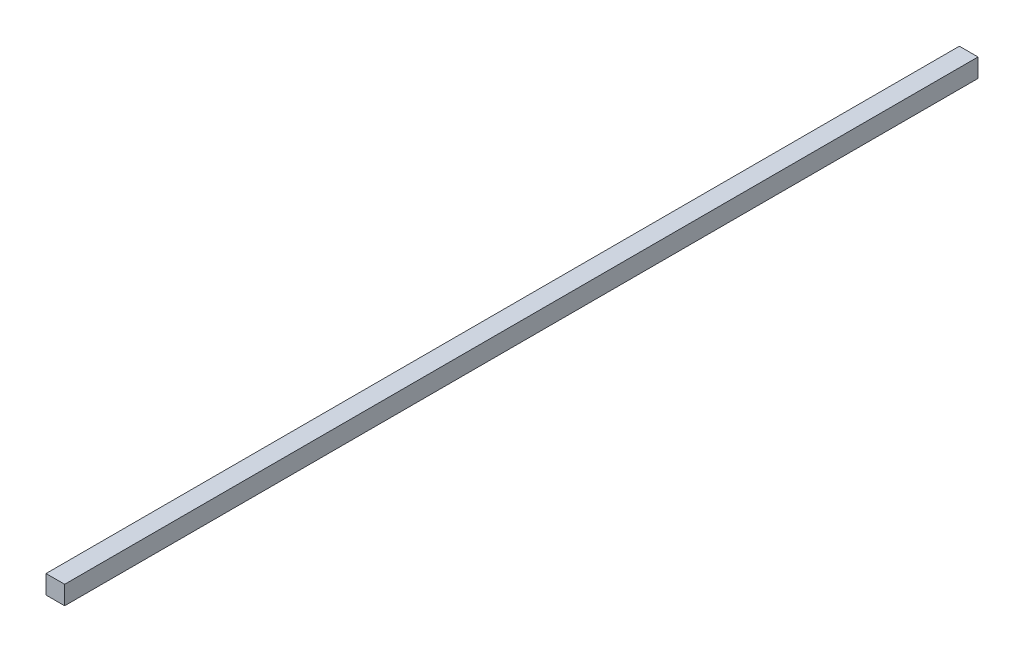
ISO-10303-21;
HEADER;
FILE_DESCRIPTION(('STEP AP214'),'2;1');
FILE_NAME('part.step','',(''),(''),'','','');
FILE_SCHEMA(('AUTOMOTIVE_DESIGN { 1 0 10303 214 1 1 1 1 }'));
ENDSEC;
DATA;
#1=APPLICATION_CONTEXT('core data for automotive mechanical design processes');
#2=APPLICATION_PROTOCOL_DEFINITION('international standard','automotive_design',2000,#1);
#3=PRODUCT_CONTEXT('',#1,'mechanical');
#4=PRODUCT('Part','Part','',(#3));
#5=PRODUCT_RELATED_PRODUCT_CATEGORY('part','',(#4));
#6=PRODUCT_DEFINITION_FORMATION('','',#4);
#7=PRODUCT_DEFINITION_CONTEXT('part definition',#1,'design');
#8=PRODUCT_DEFINITION('design','',#6,#7);
#9=PRODUCT_DEFINITION_SHAPE('','',#8);
#10=(LENGTH_UNIT() NAMED_UNIT(*) SI_UNIT(.MILLI.,.METRE.));
#11=(NAMED_UNIT(*) PLANE_ANGLE_UNIT() SI_UNIT($,.RADIAN.));
#12=(NAMED_UNIT(*) SI_UNIT($,.STERADIAN.) SOLID_ANGLE_UNIT());
#13=UNCERTAINTY_MEASURE_WITH_UNIT(LENGTH_MEASURE(1.E-05),#10,'distance_accuracy_value','');
#14=(GEOMETRIC_REPRESENTATION_CONTEXT(3) GLOBAL_UNCERTAINTY_ASSIGNED_CONTEXT((#13)) GLOBAL_UNIT_ASSIGNED_CONTEXT((#10,
#11,#12)) REPRESENTATION_CONTEXT('',''));
#15=CARTESIAN_POINT('',(0.,0.,0.));
#16=DIRECTION('',(0.,0.,1.));
#17=DIRECTION('',(1.,0.,0.));
#18=AXIS2_PLACEMENT_3D('',#15,#16,#17);
#19=CARTESIAN_POINT('',(-7.41935483870968,6.53225806451613,490.));
#20=DIRECTION('',(1.,0.,0.));
#21=DIRECTION('',(0.,0.,-1.));
#22=AXIS2_PLACEMENT_3D('',#19,#20,#21);
#23=PLANE('',#22);
#24=DIRECTION('',(0.,-1.,0.));
#25=VECTOR('',#24,1.);
#26=CARTESIAN_POINT('',(-7.41935483870968,6.53225806451613,0.));
#27=LINE('',#26,#25);
#28=CARTESIAN_POINT('',(-7.41935483870968,6.53225806451613,0.));
#29=VERTEX_POINT('',#28);
#30=CARTESIAN_POINT('',(-7.41935483870968,-3.46774193548387,0.));
#31=VERTEX_POINT('',#30);
#32=EDGE_CURVE('E96',#29,#31,#27,.T.);
#33=ORIENTED_EDGE('',*,*,#32,.T.);
#34=DIRECTION('',(0.,0.,-1.));
#35=VECTOR('',#34,1.);
#36=CARTESIAN_POINT('',(-7.41935483870968,-3.46774193548387,490.));
#37=LINE('',#36,#35);
#38=CARTESIAN_POINT('',(-7.41935483870968,-3.46774193548387,490.));
#39=VERTEX_POINT('',#38);
#40=EDGE_CURVE('E11',#39,#31,#37,.T.);
#41=ORIENTED_EDGE('',*,*,#40,.F.);
#42=DIRECTION('',(0.,-1.,0.));
#43=VECTOR('',#42,1.);
#44=CARTESIAN_POINT('',(-7.41935483870968,6.53225806451613,490.));
#45=LINE('',#44,#43);
#46=CARTESIAN_POINT('',(-7.41935483870968,6.53225806451613,490.));
#47=VERTEX_POINT('',#46);
#48=EDGE_CURVE('E84',#47,#39,#45,.T.);
#49=ORIENTED_EDGE('',*,*,#48,.F.);
#50=DIRECTION('',(0.,0.,-1.));
#51=VECTOR('',#50,1.);
#52=CARTESIAN_POINT('',(-7.41935483870968,6.53225806451613,490.));
#53=LINE('',#52,#51);
#54=EDGE_CURVE('E92',#47,#29,#53,.T.);
#55=ORIENTED_EDGE('',*,*,#54,.T.);
#56=EDGE_LOOP('',(#33,#41,#49,#55));
#57=FACE_BOUND('',#56,.T.);
#58=ADVANCED_FACE('F33',(#57),#23,.F.);
#59=CARTESIAN_POINT('',(-7.41935483870968,-3.46774193548387,490.));
#60=DIRECTION('',(0.,1.,0.));
#61=DIRECTION('',(0.,0.,1.));
#62=AXIS2_PLACEMENT_3D('',#59,#60,#61);
#63=PLANE('',#62);
#64=DIRECTION('',(1.,0.,0.));
#65=VECTOR('',#64,1.);
#66=CARTESIAN_POINT('',(-7.41935483870968,-3.46774193548387,0.));
#67=LINE('',#66,#65);
#68=CARTESIAN_POINT('',(2.58064516129032,-3.46774193548387,0.));
#69=VERTEX_POINT('',#68);
#70=EDGE_CURVE('E88',#31,#69,#67,.T.);
#71=ORIENTED_EDGE('',*,*,#70,.T.);
#72=DIRECTION('',(0.,0.,-1.));
#73=VECTOR('',#72,1.);
#74=CARTESIAN_POINT('',(2.58064516129032,-3.46774193548387,490.));
#75=LINE('',#74,#73);
#76=CARTESIAN_POINT('',(2.58064516129032,-3.46774193548387,490.));
#77=VERTEX_POINT('',#76);
#78=EDGE_CURVE('E41',#77,#69,#75,.T.);
#79=ORIENTED_EDGE('',*,*,#78,.F.);
#80=DIRECTION('',(1.,0.,0.));
#81=VECTOR('',#80,1.);
#82=CARTESIAN_POINT('',(-7.41935483870968,-3.46774193548387,490.));
#83=LINE('',#82,#81);
#84=EDGE_CURVE('E79',#39,#77,#83,.T.);
#85=ORIENTED_EDGE('',*,*,#84,.F.);
#86=ORIENTED_EDGE('',*,*,#40,.T.);
#87=EDGE_LOOP('',(#71,#79,#85,#86));
#88=FACE_BOUND('',#87,.T.);
#89=ADVANCED_FACE('F87',(#88),#63,.F.);
#90=CARTESIAN_POINT('',(2.58064516129032,6.53225806451613,490.));
#91=DIRECTION('',(-1.,0.,0.));
#92=DIRECTION('',(0.,-1.,0.));
#93=AXIS2_PLACEMENT_3D('',#90,#91,#92);
#94=PLANE('',#93);
#95=DIRECTION('',(0.,1.,0.));
#96=VECTOR('',#95,1.);
#97=CARTESIAN_POINT('',(2.58064516129032,6.53225806451613,0.));
#98=LINE('',#97,#96);
#99=CARTESIAN_POINT('',(2.58064516129032,6.53225806451613,0.));
#100=VERTEX_POINT('',#99);
#101=EDGE_CURVE('E66',#69,#100,#98,.T.);
#102=ORIENTED_EDGE('',*,*,#101,.T.);
#103=DIRECTION('',(0.,0.,-1.));
#104=VECTOR('',#103,1.);
#105=CARTESIAN_POINT('',(2.58064516129032,6.53225806451613,490.));
#106=LINE('',#105,#104);
#107=CARTESIAN_POINT('',(2.58064516129032,6.53225806451613,490.));
#108=VERTEX_POINT('',#107);
#109=EDGE_CURVE('E89',#108,#100,#106,.T.);
#110=ORIENTED_EDGE('',*,*,#109,.F.);
#111=DIRECTION('',(0.,1.,0.));
#112=VECTOR('',#111,1.);
#113=CARTESIAN_POINT('',(2.58064516129032,6.53225806451613,490.));
#114=LINE('',#113,#112);
#115=EDGE_CURVE('E82',#77,#108,#114,.T.);
#116=ORIENTED_EDGE('',*,*,#115,.F.);
#117=ORIENTED_EDGE('',*,*,#78,.T.);
#118=EDGE_LOOP('',(#102,#110,#116,#117));
#119=FACE_BOUND('',#118,.T.);
#120=ADVANCED_FACE('F90',(#119),#94,.F.);
#121=CARTESIAN_POINT('',(-7.41935483870968,6.53225806451613,490.));
#122=DIRECTION('',(0.,-1.,0.));
#123=DIRECTION('',(0.,0.,-1.));
#124=AXIS2_PLACEMENT_3D('',#121,#122,#123);
#125=PLANE('',#124);
#126=DIRECTION('',(-1.,0.,0.));
#127=VECTOR('',#126,1.);
#128=CARTESIAN_POINT('',(-7.41935483870968,6.53225806451613,0.));
#129=LINE('',#128,#127);
#130=EDGE_CURVE('E72',#100,#29,#129,.T.);
#131=ORIENTED_EDGE('',*,*,#130,.T.);
#132=ORIENTED_EDGE('',*,*,#54,.F.);
#133=DIRECTION('',(-1.,0.,0.));
#134=VECTOR('',#133,1.);
#135=CARTESIAN_POINT('',(-7.41935483870968,6.53225806451613,490.));
#136=LINE('',#135,#134);
#137=EDGE_CURVE('E49',#108,#47,#136,.T.);
#138=ORIENTED_EDGE('',*,*,#137,.F.);
#139=ORIENTED_EDGE('',*,*,#109,.T.);
#140=EDGE_LOOP('',(#131,#132,#138,#139));
#141=FACE_BOUND('',#140,.T.);
#142=ADVANCED_FACE('F103',(#141),#125,.F.);
#143=CARTESIAN_POINT('',(0.,0.,490.));
#144=DIRECTION('',(0.,0.,1.));
#145=DIRECTION('',(1.,0.,0.));
#146=AXIS2_PLACEMENT_3D('',#143,#144,#145);
#147=PLANE('',#146);
#148=ORIENTED_EDGE('',*,*,#48,.T.);
#149=ORIENTED_EDGE('',*,*,#84,.T.);
#150=ORIENTED_EDGE('',*,*,#115,.T.);
#151=ORIENTED_EDGE('',*,*,#137,.T.);
#152=EDGE_LOOP('',(#148,#149,#150,#151));
#153=FACE_BOUND('',#152,.T.);
#154=ADVANCED_FACE('F80',(#153),#147,.T.);
#155=CARTESIAN_POINT('',(0.,0.,0.));
#156=DIRECTION('',(0.,0.,1.));
#157=DIRECTION('',(1.,0.,0.));
#158=AXIS2_PLACEMENT_3D('',#155,#156,#157);
#159=PLANE('',#158);
#160=ORIENTED_EDGE('',*,*,#32,.F.);
#161=ORIENTED_EDGE('',*,*,#130,.F.);
#162=ORIENTED_EDGE('',*,*,#101,.F.);
#163=ORIENTED_EDGE('',*,*,#70,.F.);
#164=EDGE_LOOP('',(#160,#161,#162,#163));
#165=FACE_BOUND('',#164,.T.);
#166=ADVANCED_FACE('F106',(#165),#159,.F.);
#167=CLOSED_SHELL('',(#58,#89,#120,#142,#154,#166));
#168=MANIFOLD_SOLID_BREP('B2',#167);
#169=ADVANCED_BREP_SHAPE_REPRESENTATION('',(#18,#168),#14);
#170=SHAPE_DEFINITION_REPRESENTATION(#9,#169);
ENDSEC;
END-ISO-10303-21;
